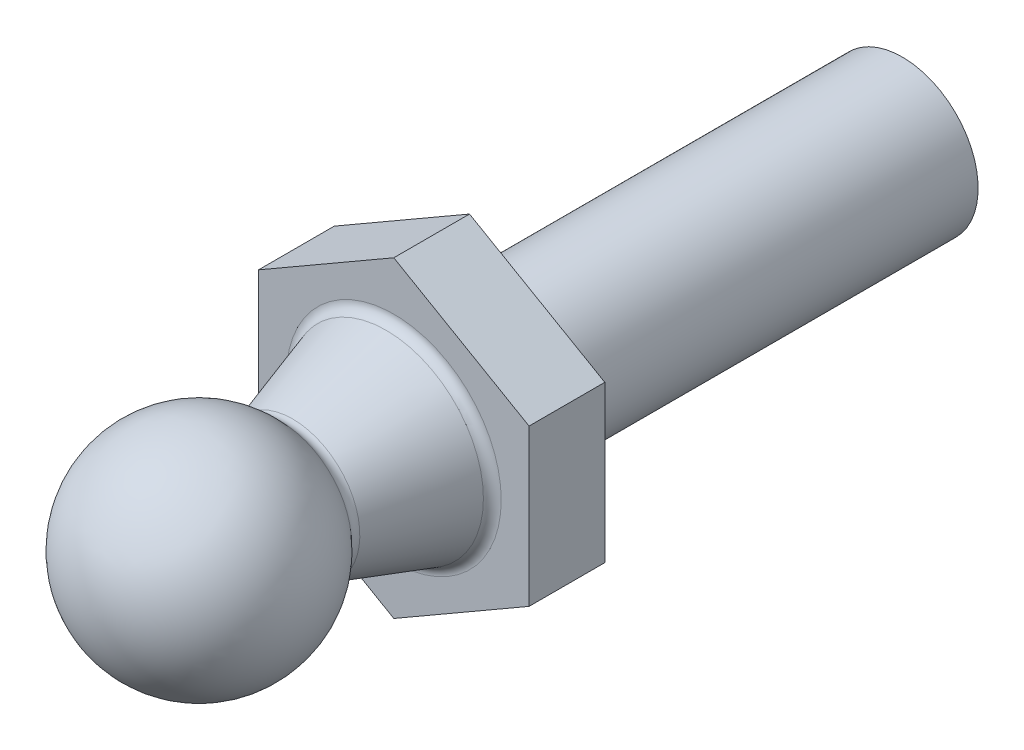
ISO-10303-21;
HEADER;
FILE_DESCRIPTION(('STEP AP214'),'2;1');
FILE_NAME('part.step','',(''),(''),'','','');
FILE_SCHEMA(('AUTOMOTIVE_DESIGN { 1 0 10303 214 1 1 1 1 }'));
ENDSEC;
DATA;
#1=APPLICATION_CONTEXT('core data for automotive mechanical design processes');
#2=APPLICATION_PROTOCOL_DEFINITION('international standard','automotive_design',2000,#1);
#3=PRODUCT_CONTEXT('',#1,'mechanical');
#4=PRODUCT('Part','Part','',(#3));
#5=PRODUCT_RELATED_PRODUCT_CATEGORY('part','',(#4));
#6=PRODUCT_DEFINITION_FORMATION('','',#4);
#7=PRODUCT_DEFINITION_CONTEXT('part definition',#1,'design');
#8=PRODUCT_DEFINITION('design','',#6,#7);
#9=PRODUCT_DEFINITION_SHAPE('','',#8);
#10=(LENGTH_UNIT() NAMED_UNIT(*) SI_UNIT(.MILLI.,.METRE.));
#11=(NAMED_UNIT(*) PLANE_ANGLE_UNIT() SI_UNIT($,.RADIAN.));
#12=(NAMED_UNIT(*) SI_UNIT($,.STERADIAN.) SOLID_ANGLE_UNIT());
#13=UNCERTAINTY_MEASURE_WITH_UNIT(LENGTH_MEASURE(1.E-05),#10,'distance_accuracy_value','');
#14=(GEOMETRIC_REPRESENTATION_CONTEXT(3) GLOBAL_UNCERTAINTY_ASSIGNED_CONTEXT((#13)) GLOBAL_UNIT_ASSIGNED_CONTEXT((#10,
#11,#12)) REPRESENTATION_CONTEXT('',''));
#15=CARTESIAN_POINT('',(0.,0.,0.));
#16=DIRECTION('',(0.,0.,1.));
#17=DIRECTION('',(1.,0.,0.));
#18=AXIS2_PLACEMENT_3D('',#15,#16,#17);
#19=CARTESIAN_POINT('',(6.24999999999996,3.60843918243524,3.5));
#20=DIRECTION('',(-0.499999999999995,-0.866025403784442,0.));
#21=DIRECTION('',(0.866025403784442,-0.499999999999995,0.));
#22=AXIS2_PLACEMENT_3D('',#19,#20,#21);
#23=PLANE('',#22);
#24=DIRECTION('',(-0.866025403784442,0.499999999999995,0.));
#25=VECTOR('',#24,1.);
#26=CARTESIAN_POINT('',(6.24999999999996,3.60843918243524,0.));
#27=LINE('',#26,#25);
#28=CARTESIAN_POINT('',(6.24999999999996,3.60843918243524,0.));
#29=VERTEX_POINT('',#28);
#30=CARTESIAN_POINT('',(0.,7.21687836487033,0.));
#31=VERTEX_POINT('',#30);
#32=EDGE_CURVE('E132',#29,#31,#27,.T.);
#33=ORIENTED_EDGE('',*,*,#32,.T.);
#34=DIRECTION('',(0.,0.,-1.));
#35=VECTOR('',#34,1.);
#36=CARTESIAN_POINT('',(0.,7.21687836487033,3.5));
#37=LINE('',#36,#35);
#38=CARTESIAN_POINT('',(0.,7.21687836487033,3.5));
#39=VERTEX_POINT('',#38);
#40=EDGE_CURVE('E160',#39,#31,#37,.T.);
#41=ORIENTED_EDGE('',*,*,#40,.F.);
#42=DIRECTION('',(-0.866025403784442,0.499999999999995,0.));
#43=VECTOR('',#42,1.);
#44=CARTESIAN_POINT('',(6.24999999999996,3.60843918243524,3.5));
#45=LINE('',#44,#43);
#46=CARTESIAN_POINT('',(6.24999999999996,3.60843918243524,3.5));
#47=VERTEX_POINT('',#46);
#48=EDGE_CURVE('E149',#47,#39,#45,.T.);
#49=ORIENTED_EDGE('',*,*,#48,.F.);
#50=DIRECTION('',(0.,0.,-1.));
#51=VECTOR('',#50,1.);
#52=CARTESIAN_POINT('',(6.24999999999996,3.60843918243524,3.5));
#53=LINE('',#52,#51);
#54=EDGE_CURVE('E128',#47,#29,#53,.T.);
#55=ORIENTED_EDGE('',*,*,#54,.T.);
#56=EDGE_LOOP('',(#33,#41,#49,#55));
#57=FACE_BOUND('',#56,.T.);
#58=ADVANCED_FACE('F41',(#57),#23,.F.);
#59=CARTESIAN_POINT('',(0.,7.21687836487033,3.5));
#60=DIRECTION('',(0.500000000000001,-0.866025403784438,0.));
#61=DIRECTION('',(0.866025403784438,0.500000000000001,0.));
#62=AXIS2_PLACEMENT_3D('',#59,#60,#61);
#63=PLANE('',#62);
#64=DIRECTION('',(-0.866025403784438,-0.500000000000001,0.));
#65=VECTOR('',#64,1.);
#66=CARTESIAN_POINT('',(0.,7.21687836487033,0.));
#67=LINE('',#66,#65);
#68=CARTESIAN_POINT('',(-6.25000000000001,3.60843918243515,0.));
#69=VERTEX_POINT('',#68);
#70=EDGE_CURVE('E136',#31,#69,#67,.T.);
#71=ORIENTED_EDGE('',*,*,#70,.T.);
#72=DIRECTION('',(0.,0.,-1.));
#73=VECTOR('',#72,1.);
#74=CARTESIAN_POINT('',(-6.25000000000001,3.60843918243515,3.5));
#75=LINE('',#74,#73);
#76=CARTESIAN_POINT('',(-6.25000000000001,3.60843918243515,3.5));
#77=VERTEX_POINT('',#76);
#78=EDGE_CURVE('E156',#77,#69,#75,.T.);
#79=ORIENTED_EDGE('',*,*,#78,.F.);
#80=DIRECTION('',(-0.866025403784438,-0.500000000000001,0.));
#81=VECTOR('',#80,1.);
#82=CARTESIAN_POINT('',(0.,7.21687836487033,3.5));
#83=LINE('',#82,#81);
#84=EDGE_CURVE('E97',#39,#77,#83,.T.);
#85=ORIENTED_EDGE('',*,*,#84,.F.);
#86=ORIENTED_EDGE('',*,*,#40,.T.);
#87=EDGE_LOOP('',(#71,#79,#85,#86));
#88=FACE_BOUND('',#87,.T.);
#89=ADVANCED_FACE('F206',(#88),#63,.F.);
#90=CARTESIAN_POINT('',(-6.25000000000001,3.60843918243515,3.5));
#91=DIRECTION('',(1.,0.,0.));
#92=DIRECTION('',(0.,1.,0.));
#93=AXIS2_PLACEMENT_3D('',#90,#91,#92);
#94=PLANE('',#93);
#95=DIRECTION('',(0.,-1.,0.));
#96=VECTOR('',#95,1.);
#97=CARTESIAN_POINT('',(-6.25000000000001,3.60843918243515,0.));
#98=LINE('',#97,#96);
#99=CARTESIAN_POINT('',(-6.24999999999999,-3.60843918243519,0.));
#100=VERTEX_POINT('',#99);
#101=EDGE_CURVE('E140',#69,#100,#98,.T.);
#102=ORIENTED_EDGE('',*,*,#101,.T.);
#103=DIRECTION('',(0.,0.,-1.));
#104=VECTOR('',#103,1.);
#105=CARTESIAN_POINT('',(-6.24999999999999,-3.60843918243519,3.5));
#106=LINE('',#105,#104);
#107=CARTESIAN_POINT('',(-6.24999999999999,-3.60843918243519,3.5));
#108=VERTEX_POINT('',#107);
#109=EDGE_CURVE('E121',#108,#100,#106,.T.);
#110=ORIENTED_EDGE('',*,*,#109,.F.);
#111=DIRECTION('',(0.,-1.,0.));
#112=VECTOR('',#111,1.);
#113=CARTESIAN_POINT('',(-6.25000000000001,3.60843918243515,3.5));
#114=LINE('',#113,#112);
#115=EDGE_CURVE('E110',#77,#108,#114,.T.);
#116=ORIENTED_EDGE('',*,*,#115,.F.);
#117=ORIENTED_EDGE('',*,*,#78,.T.);
#118=EDGE_LOOP('',(#102,#110,#116,#117));
#119=FACE_BOUND('',#118,.T.);
#120=ADVANCED_FACE('F212',(#119),#94,.F.);
#121=CARTESIAN_POINT('',(-6.24999999999999,-3.60843918243519,3.5));
#122=DIRECTION('',(0.499999999999995,0.866025403784441,0.));
#123=DIRECTION('',(-0.866025403784441,0.499999999999995,0.));
#124=AXIS2_PLACEMENT_3D('',#121,#122,#123);
#125=PLANE('',#124);
#126=DIRECTION('',(0.866025403784442,-0.499999999999995,0.));
#127=VECTOR('',#126,1.);
#128=CARTESIAN_POINT('',(-6.24999999999999,-3.60843918243519,0.));
#129=LINE('',#128,#127);
#130=CARTESIAN_POINT('',(0.,-7.21687836487033,0.));
#131=VERTEX_POINT('',#130);
#132=EDGE_CURVE('E119',#100,#131,#129,.T.);
#133=ORIENTED_EDGE('',*,*,#132,.T.);
#134=DIRECTION('',(0.,0.,-1.));
#135=VECTOR('',#134,1.);
#136=CARTESIAN_POINT('',(0.,-7.21687836487033,3.5));
#137=LINE('',#136,#135);
#138=CARTESIAN_POINT('',(0.,-7.21687836487033,3.5));
#139=VERTEX_POINT('',#138);
#140=EDGE_CURVE('E116',#139,#131,#137,.T.);
#141=ORIENTED_EDGE('',*,*,#140,.F.);
#142=DIRECTION('',(0.866025403784442,-0.499999999999995,0.));
#143=VECTOR('',#142,1.);
#144=CARTESIAN_POINT('',(-6.24999999999999,-3.60843918243519,3.5));
#145=LINE('',#144,#143);
#146=EDGE_CURVE('E104',#108,#139,#145,.T.);
#147=ORIENTED_EDGE('',*,*,#146,.F.);
#148=ORIENTED_EDGE('',*,*,#109,.T.);
#149=EDGE_LOOP('',(#133,#141,#147,#148));
#150=FACE_BOUND('',#149,.T.);
#151=ADVANCED_FACE('F117',(#150),#125,.F.);
#152=CARTESIAN_POINT('',(0.,-7.21687836487033,3.5));
#153=DIRECTION('',(-0.500000000000007,0.866025403784434,0.));
#154=DIRECTION('',(-0.866025403784435,-0.500000000000007,0.));
#155=AXIS2_PLACEMENT_3D('',#152,#153,#154);
#156=PLANE('',#155);
#157=DIRECTION('',(0.866025403784435,0.500000000000007,0.));
#158=VECTOR('',#157,1.);
#159=CARTESIAN_POINT('',(0.,-7.21687836487033,0.));
#160=LINE('',#159,#158);
#161=CARTESIAN_POINT('',(6.25000000000004,-3.60843918243511,0.));
#162=VERTEX_POINT('',#161);
#163=EDGE_CURVE('E82',#131,#162,#160,.T.);
#164=ORIENTED_EDGE('',*,*,#163,.T.);
#165=DIRECTION('',(0.,0.,-1.));
#166=VECTOR('',#165,1.);
#167=CARTESIAN_POINT('',(6.25000000000004,-3.60843918243511,3.5));
#168=LINE('',#167,#166);
#169=CARTESIAN_POINT('',(6.25000000000004,-3.60843918243511,3.5));
#170=VERTEX_POINT('',#169);
#171=EDGE_CURVE('E122',#170,#162,#168,.T.);
#172=ORIENTED_EDGE('',*,*,#171,.F.);
#173=DIRECTION('',(0.866025403784435,0.500000000000007,0.));
#174=VECTOR('',#173,1.);
#175=CARTESIAN_POINT('',(0.,-7.21687836487033,3.5));
#176=LINE('',#175,#174);
#177=EDGE_CURVE('E108',#139,#170,#176,.T.);
#178=ORIENTED_EDGE('',*,*,#177,.F.);
#179=ORIENTED_EDGE('',*,*,#140,.T.);
#180=EDGE_LOOP('',(#164,#172,#178,#179));
#181=FACE_BOUND('',#180,.T.);
#182=ADVANCED_FACE('F124',(#181),#156,.F.);
#183=CARTESIAN_POINT('',(6.25000000000004,-3.60843918243511,3.5));
#184=DIRECTION('',(-1.,0.,0.));
#185=DIRECTION('',(0.,-1.,0.));
#186=AXIS2_PLACEMENT_3D('',#183,#184,#185);
#187=PLANE('',#186);
#188=DIRECTION('',(0.,1.,0.));
#189=VECTOR('',#188,1.);
#190=CARTESIAN_POINT('',(6.25000000000004,-3.60843918243511,0.));
#191=LINE('',#190,#189);
#192=EDGE_CURVE('E88',#162,#29,#191,.T.);
#193=ORIENTED_EDGE('',*,*,#192,.T.);
#194=ORIENTED_EDGE('',*,*,#54,.F.);
#195=DIRECTION('',(0.,1.,0.));
#196=VECTOR('',#195,1.);
#197=CARTESIAN_POINT('',(6.25000000000004,-3.60843918243511,3.5));
#198=LINE('',#197,#196);
#199=EDGE_CURVE('E59',#170,#47,#198,.T.);
#200=ORIENTED_EDGE('',*,*,#199,.F.);
#201=ORIENTED_EDGE('',*,*,#171,.T.);
#202=EDGE_LOOP('',(#193,#194,#200,#201));
#203=FACE_BOUND('',#202,.T.);
#204=ADVANCED_FACE('F194',(#203),#187,.F.);
#205=CARTESIAN_POINT('',(0.,0.,3.5));
#206=DIRECTION('',(0.,0.,1.));
#207=DIRECTION('',(1.,0.,0.));
#208=AXIS2_PLACEMENT_3D('',#205,#206,#207);
#209=PLANE('',#208);
#210=CARTESIAN_POINT('',(0.,0.,3.5));
#211=DIRECTION('',(0.,0.,1.));
#212=DIRECTION('',(1.,0.,0.));
#213=AXIS2_PLACEMENT_3D('',#210,#211,#212);
#214=CIRCLE('',#213,4.9649761899362);
#215=CARTESIAN_POINT('',(4.9649761899362,0.,3.5));
#216=VERTEX_POINT('',#215);
#217=EDGE_CURVE('E11',#216,#216,#214,.F.);
#218=ORIENTED_EDGE('',*,*,#217,.T.);
#219=EDGE_LOOP('',(#218));
#220=FACE_BOUND('',#219,.T.);
#221=ORIENTED_EDGE('',*,*,#48,.T.);
#222=ORIENTED_EDGE('',*,*,#84,.T.);
#223=ORIENTED_EDGE('',*,*,#115,.T.);
#224=ORIENTED_EDGE('',*,*,#146,.T.);
#225=ORIENTED_EDGE('',*,*,#177,.T.);
#226=ORIENTED_EDGE('',*,*,#199,.T.);
#227=EDGE_LOOP('',(#221,#222,#223,#224,#225,#226));
#228=FACE_BOUND('',#227,.T.);
#229=ADVANCED_FACE('F106',(#220,#228),#209,.T.);
#230=CARTESIAN_POINT('',(0.,0.,0.));
#231=DIRECTION('',(0.,0.,1.));
#232=DIRECTION('',(1.,0.,0.));
#233=AXIS2_PLACEMENT_3D('',#230,#231,#232);
#234=PLANE('',#233);
#235=CARTESIAN_POINT('',(0.,0.,0.));
#236=DIRECTION('',(0.,0.,-1.));
#237=DIRECTION('',(-1.,0.,0.));
#238=AXIS2_PLACEMENT_3D('',#235,#236,#237);
#239=CIRCLE('',#238,3.5);
#240=CARTESIAN_POINT('',(-3.5,0.,0.));
#241=VERTEX_POINT('',#240);
#242=EDGE_CURVE('E163',#241,#241,#239,.T.);
#243=ORIENTED_EDGE('',*,*,#242,.F.);
#244=EDGE_LOOP('',(#243));
#245=FACE_BOUND('',#244,.T.);
#246=ORIENTED_EDGE('',*,*,#32,.F.);
#247=ORIENTED_EDGE('',*,*,#192,.F.);
#248=ORIENTED_EDGE('',*,*,#163,.F.);
#249=ORIENTED_EDGE('',*,*,#132,.F.);
#250=ORIENTED_EDGE('',*,*,#101,.F.);
#251=ORIENTED_EDGE('',*,*,#70,.F.);
#252=EDGE_LOOP('',(#246,#247,#248,#249,#250,#251));
#253=FACE_BOUND('',#252,.T.);
#254=ADVANCED_FACE('F193',(#245,#253),#234,.F.);
#255=CARTESIAN_POINT('',(0.,0.,-20.));
#256=DIRECTION('',(0.,0.,1.));
#257=DIRECTION('',(1.,0.,0.));
#258=AXIS2_PLACEMENT_3D('',#255,#256,#257);
#259=CYLINDRICAL_SURFACE('',#258,3.5);
#260=CARTESIAN_POINT('',(0.,0.,-20.));
#261=DIRECTION('',(0.,0.,-1.));
#262=DIRECTION('',(-1.,0.,0.));
#263=AXIS2_PLACEMENT_3D('',#260,#261,#262);
#264=CIRCLE('',#263,3.5);
#265=CARTESIAN_POINT('',(-3.5,0.,-20.));
#266=VERTEX_POINT('',#265);
#267=EDGE_CURVE('E137',#266,#266,#264,.T.);
#268=ORIENTED_EDGE('',*,*,#267,.F.);
#269=EDGE_LOOP('',(#268));
#270=FACE_BOUND('',#269,.T.);
#271=ORIENTED_EDGE('',*,*,#242,.T.);
#272=EDGE_LOOP('',(#271));
#273=FACE_BOUND('',#272,.T.);
#274=ADVANCED_FACE('F200',(#270,#273),#259,.T.);
#275=CARTESIAN_POINT('',(0.,0.,-20.));
#276=DIRECTION('',(0.,0.,-1.));
#277=DIRECTION('',(-1.,0.,0.));
#278=AXIS2_PLACEMENT_3D('',#275,#276,#277);
#279=PLANE('',#278);
#280=ORIENTED_EDGE('',*,*,#267,.T.);
#281=EDGE_LOOP('',(#280));
#282=FACE_BOUND('',#281,.T.);
#283=ADVANCED_FACE('F245',(#282),#279,.T.);
#284=CARTESIAN_POINT('',(0.,0.,12.5));
#285=DIRECTION('',(0.,0.,-1.));
#286=DIRECTION('',(0.,1.,0.));
#287=AXIS2_PLACEMENT_3D('',#284,#285,#286);
#288=SPHERICAL_SURFACE('',#287,5.);
#289=CARTESIAN_POINT('',(0.,0.,8.70488849464254));
#290=DIRECTION('',(0.,0.,1.));
#291=DIRECTION('',(0.,-1.,0.));
#292=AXIS2_PLACEMENT_3D('',#289,#290,#291);
#293=CIRCLE('',#292,3.25532312711095);
#294=CARTESIAN_POINT('',(0.,-3.25532312711093,8.70488849464252));
#295=VERTEX_POINT('',#294);
#296=EDGE_CURVE('E51',#295,#295,#293,.T.);
#297=ORIENTED_EDGE('',*,*,#296,.T.);
#298=EDGE_LOOP('',(#297));
#299=FACE_BOUND('',#298,.T.);
#300=ADVANCED_FACE('F175',(#299),#288,.T.);
#301=CARTESIAN_POINT('',(0.,0.,3.49999999999998));
#302=DIRECTION('',(0.,0.,-1.));
#303=DIRECTION('',(0.,1.,0.));
#304=AXIS2_PLACEMENT_3D('',#301,#302,#303);
#305=CONICAL_SURFACE('',#304,4.59999999999993,0.309702944542451);
#306=CARTESIAN_POINT('',(0.,0.,8.1729894805549));
#307=DIRECTION('',(0.,0.,-1.));
#308=DIRECTION('',(0.,1.,0.));
#309=AXIS2_PLACEMENT_3D('',#306,#307,#308);
#310=CIRCLE('',#309,3.10464336622238);
#311=CARTESIAN_POINT('',(0.,3.1046433662224,8.17298948055492));
#312=VERTEX_POINT('',#311);
#313=EDGE_CURVE('E168',#312,#312,#310,.T.);
#314=ORIENTED_EDGE('',*,*,#313,.T.);
#315=EDGE_LOOP('',(#314));
#316=FACE_BOUND('',#315,.T.);
#317=CARTESIAN_POINT('',(0.,0.,3.84761213644811));
#318=DIRECTION('',(0.,0.,-1.));
#319=DIRECTION('',(0.,1.,0.));
#320=AXIS2_PLACEMENT_3D('',#317,#318,#319);
#321=CIRCLE('',#320,4.48876411633653);
#322=CARTESIAN_POINT('',(0.,4.4887641163366,3.84761213644813));
#323=VERTEX_POINT('',#322);
#324=EDGE_CURVE('E164',#323,#323,#321,.F.);
#325=ORIENTED_EDGE('',*,*,#324,.T.);
#326=EDGE_LOOP('',(#325));
#327=FACE_BOUND('',#326,.T.);
#328=ADVANCED_FACE('F180',(#316,#327),#305,.T.);
#329=CARTESIAN_POINT('',(0.,0.,8.32537734410679));
#330=DIRECTION('',(0.,0.,1.));
#331=DIRECTION('',(0.,-1.,0.));
#332=AXIS2_PLACEMENT_3D('',#329,#330,#331);
#333=TOROIDAL_SURFACE('',#332,3.58085543982205,0.5);
#334=ORIENTED_EDGE('',*,*,#296,.F.);
#335=EDGE_LOOP('',(#334));
#336=FACE_BOUND('',#335,.T.);
#337=ORIENTED_EDGE('',*,*,#313,.F.);
#338=EDGE_LOOP('',(#337));
#339=FACE_BOUND('',#338,.T.);
#340=ADVANCED_FACE('F177',(#336,#339),#333,.F.);
#341=CARTESIAN_POINT('',(0.,0.,4.));
#342=DIRECTION('',(0.,0.,1.));
#343=DIRECTION('',(1.,0.,0.));
#344=AXIS2_PLACEMENT_3D('',#341,#342,#343);
#345=TOROIDAL_SURFACE('',#344,4.9649761899362,0.5);
#346=ORIENTED_EDGE('',*,*,#324,.F.);
#347=EDGE_LOOP('',(#346));
#348=FACE_BOUND('',#347,.T.);
#349=ORIENTED_EDGE('',*,*,#217,.F.);
#350=EDGE_LOOP('',(#349));
#351=FACE_BOUND('',#350,.T.);
#352=ADVANCED_FACE('F43',(#348,#351),#345,.F.);
#353=CLOSED_SHELL('',(#58,#89,#120,#151,#182,#204,#229,#254,#274,#283,#300,#328,#340,#352));
#354=MANIFOLD_SOLID_BREP('B2',#353);
#355=ADVANCED_BREP_SHAPE_REPRESENTATION('',(#18,#354),#14);
#356=SHAPE_DEFINITION_REPRESENTATION(#9,#355);
ENDSEC;
END-ISO-10303-21;
